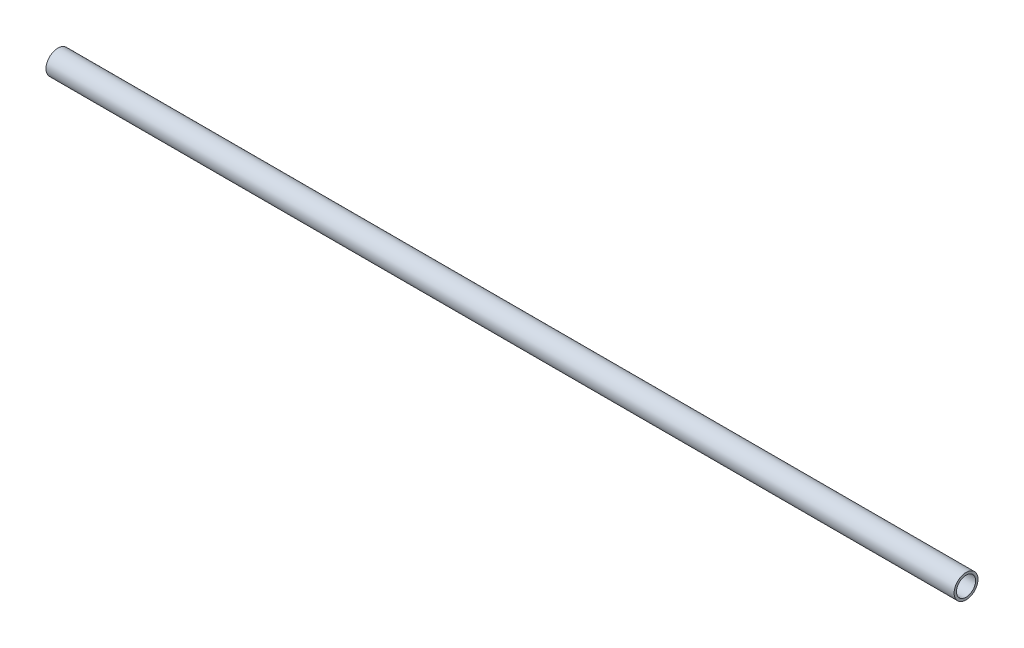
ISO-10303-21;
HEADER;
FILE_DESCRIPTION(('STEP AP214'),'2;1');
FILE_NAME('part.step','',(''),(''),'','','');
FILE_SCHEMA(('AUTOMOTIVE_DESIGN { 1 0 10303 214 1 1 1 1 }'));
ENDSEC;
DATA;
#1=APPLICATION_CONTEXT('core data for automotive mechanical design processes');
#2=APPLICATION_PROTOCOL_DEFINITION('international standard','automotive_design',2000,#1);
#3=PRODUCT_CONTEXT('',#1,'mechanical');
#4=PRODUCT('Part','Part','',(#3));
#5=PRODUCT_RELATED_PRODUCT_CATEGORY('part','',(#4));
#6=PRODUCT_DEFINITION_FORMATION('','',#4);
#7=PRODUCT_DEFINITION_CONTEXT('part definition',#1,'design');
#8=PRODUCT_DEFINITION('design','',#6,#7);
#9=PRODUCT_DEFINITION_SHAPE('','',#8);
#10=(LENGTH_UNIT() NAMED_UNIT(*) SI_UNIT(.MILLI.,.METRE.));
#11=(NAMED_UNIT(*) PLANE_ANGLE_UNIT() SI_UNIT($,.RADIAN.));
#12=(NAMED_UNIT(*) SI_UNIT($,.STERADIAN.) SOLID_ANGLE_UNIT());
#13=UNCERTAINTY_MEASURE_WITH_UNIT(LENGTH_MEASURE(1.E-05),#10,'distance_accuracy_value','');
#14=(GEOMETRIC_REPRESENTATION_CONTEXT(3) GLOBAL_UNCERTAINTY_ASSIGNED_CONTEXT((#13)) GLOBAL_UNIT_ASSIGNED_CONTEXT((#10,
#11,#12)) REPRESENTATION_CONTEXT('',''));
#15=CARTESIAN_POINT('',(0.,0.,0.));
#16=DIRECTION('',(0.,0.,1.));
#17=DIRECTION('',(1.,0.,0.));
#18=AXIS2_PLACEMENT_3D('',#15,#16,#17);
#19=CARTESIAN_POINT('',(-190.132445986145,0.,223.378969569803));
#20=DIRECTION('',(1.,0.,0.));
#21=DIRECTION('',(0.,0.,-1.));
#22=AXIS2_PLACEMENT_3D('',#19,#20,#21);
#23=PLANE('',#22);
#24=CARTESIAN_POINT('',(-190.132445986145,0.,223.378969569803));
#25=DIRECTION('',(1.,0.,0.));
#26=DIRECTION('',(0.,0.,-1.));
#27=AXIS2_PLACEMENT_3D('',#24,#25,#26);
#28=CIRCLE('',#27,4.);
#29=CARTESIAN_POINT('',(-190.132445986145,0.,219.378969569803));
#30=VERTEX_POINT('',#29);
#31=EDGE_CURVE('E70',#30,#30,#28,.F.);
#32=ORIENTED_EDGE('',*,*,#31,.F.);
#33=EDGE_LOOP('',(#32));
#34=FACE_BOUND('',#33,.T.);
#35=CARTESIAN_POINT('',(-190.132445986145,0.,223.378969569803));
#36=DIRECTION('',(1.,0.,0.));
#37=DIRECTION('',(0.,0.,-1.));
#38=AXIS2_PLACEMENT_3D('',#35,#36,#37);
#39=CIRCLE('',#38,5.);
#40=CARTESIAN_POINT('',(-190.132445986145,0.,218.378969569803));
#41=VERTEX_POINT('',#40);
#42=EDGE_CURVE('E60',#41,#41,#39,.T.);
#43=ORIENTED_EDGE('',*,*,#42,.F.);
#44=EDGE_LOOP('',(#43));
#45=FACE_BOUND('',#44,.T.);
#46=ADVANCED_FACE('F53',(#34,#45),#23,.F.);
#47=CARTESIAN_POINT('',(190.132445986145,0.,223.378969569803));
#48=DIRECTION('',(1.,0.,0.));
#49=DIRECTION('',(0.,0.,-1.));
#50=AXIS2_PLACEMENT_3D('',#47,#48,#49);
#51=PLANE('',#50);
#52=CARTESIAN_POINT('',(190.132445986145,0.,223.378969569803));
#53=DIRECTION('',(1.,0.,0.));
#54=DIRECTION('',(0.,0.,-1.));
#55=AXIS2_PLACEMENT_3D('',#52,#53,#54);
#56=CIRCLE('',#55,4.);
#57=CARTESIAN_POINT('',(190.132445986145,0.,219.378969569803));
#58=VERTEX_POINT('',#57);
#59=EDGE_CURVE('E65',#58,#58,#56,.F.);
#60=ORIENTED_EDGE('',*,*,#59,.T.);
#61=EDGE_LOOP('',(#60));
#62=FACE_BOUND('',#61,.T.);
#63=CARTESIAN_POINT('',(190.132445986145,0.,223.378969569803));
#64=DIRECTION('',(1.,0.,0.));
#65=DIRECTION('',(0.,0.,-1.));
#66=AXIS2_PLACEMENT_3D('',#63,#64,#65);
#67=CIRCLE('',#66,5.);
#68=CARTESIAN_POINT('',(190.132445986145,0.,218.378969569803));
#69=VERTEX_POINT('',#68);
#70=EDGE_CURVE('E11',#69,#69,#67,.T.);
#71=ORIENTED_EDGE('',*,*,#70,.T.);
#72=EDGE_LOOP('',(#71));
#73=FACE_BOUND('',#72,.T.);
#74=ADVANCED_FACE('F82',(#62,#73),#51,.T.);
#75=CARTESIAN_POINT('',(-190.132445986145,0.,223.378969569803));
#76=DIRECTION('',(1.,0.,0.));
#77=DIRECTION('',(0.,0.,-1.));
#78=AXIS2_PLACEMENT_3D('',#75,#76,#77);
#79=CYLINDRICAL_SURFACE('',#78,5.);
#80=ORIENTED_EDGE('',*,*,#70,.F.);
#81=EDGE_LOOP('',(#80));
#82=FACE_BOUND('',#81,.T.);
#83=ORIENTED_EDGE('',*,*,#42,.T.);
#84=EDGE_LOOP('',(#83));
#85=FACE_BOUND('',#84,.T.);
#86=ADVANCED_FACE('F86',(#82,#85),#79,.T.);
#87=CARTESIAN_POINT('',(-194.132445986145,0.,223.378969569803));
#88=DIRECTION('',(1.,0.,0.));
#89=DIRECTION('',(0.,0.,-1.));
#90=AXIS2_PLACEMENT_3D('',#87,#88,#89);
#91=CYLINDRICAL_SURFACE('',#90,4.);
#92=ORIENTED_EDGE('',*,*,#31,.T.);
#93=EDGE_LOOP('',(#92));
#94=FACE_BOUND('',#93,.T.);
#95=ORIENTED_EDGE('',*,*,#59,.F.);
#96=EDGE_LOOP('',(#95));
#97=FACE_BOUND('',#96,.T.);
#98=ADVANCED_FACE('F77',(#94,#97),#91,.F.);
#99=CLOSED_SHELL('',(#46,#74,#86,#98));
#100=MANIFOLD_SOLID_BREP('B2',#99);
#101=ADVANCED_BREP_SHAPE_REPRESENTATION('',(#18,#100),#14);
#102=SHAPE_DEFINITION_REPRESENTATION(#9,#101);
ENDSEC;
END-ISO-10303-21;
